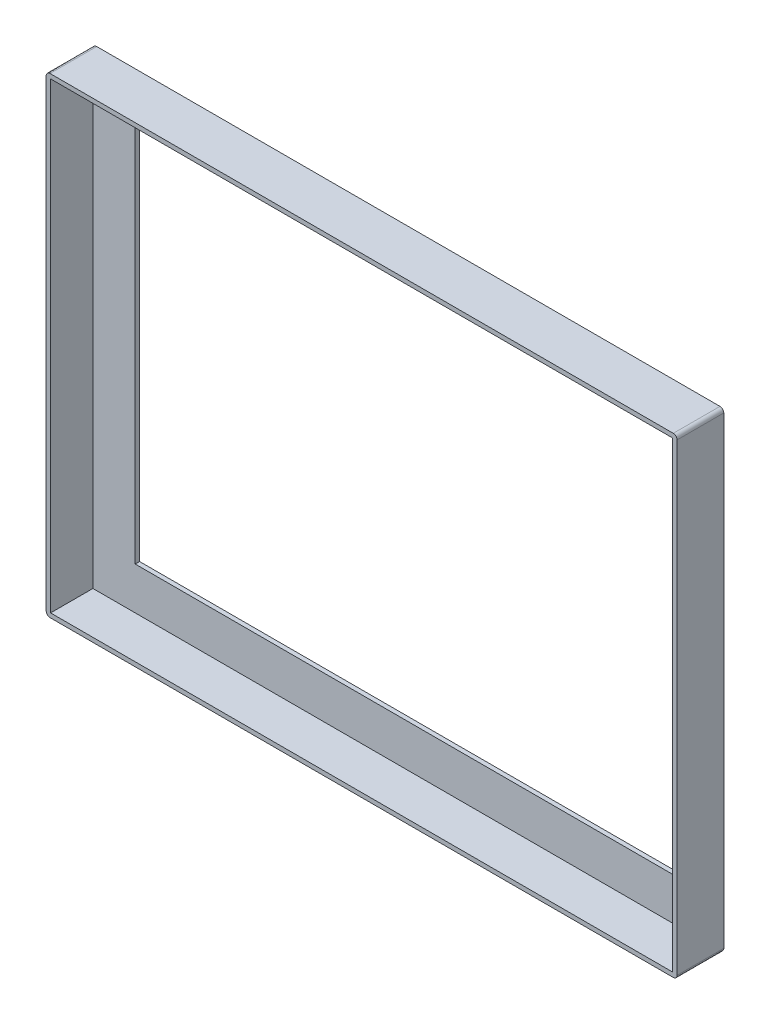
ISO-10303-21;
HEADER;
FILE_DESCRIPTION(('STEP AP214'),'2;1');
FILE_NAME('part.step','',(''),(''),'','','');
FILE_SCHEMA(('AUTOMOTIVE_DESIGN { 1 0 10303 214 1 1 1 1 }'));
ENDSEC;
DATA;
#1=APPLICATION_CONTEXT('core data for automotive mechanical design processes');
#2=APPLICATION_PROTOCOL_DEFINITION('international standard','automotive_design',2000,#1);
#3=PRODUCT_CONTEXT('',#1,'mechanical');
#4=PRODUCT('Part','Part','',(#3));
#5=PRODUCT_RELATED_PRODUCT_CATEGORY('part','',(#4));
#6=PRODUCT_DEFINITION_FORMATION('','',#4);
#7=PRODUCT_DEFINITION_CONTEXT('part definition',#1,'design');
#8=PRODUCT_DEFINITION('design','',#6,#7);
#9=PRODUCT_DEFINITION_SHAPE('','',#8);
#10=(LENGTH_UNIT() NAMED_UNIT(*) SI_UNIT(.MILLI.,.METRE.));
#11=(NAMED_UNIT(*) PLANE_ANGLE_UNIT() SI_UNIT($,.RADIAN.));
#12=(NAMED_UNIT(*) SI_UNIT($,.STERADIAN.) SOLID_ANGLE_UNIT());
#13=UNCERTAINTY_MEASURE_WITH_UNIT(LENGTH_MEASURE(1.E-05),#10,'distance_accuracy_value','');
#14=(GEOMETRIC_REPRESENTATION_CONTEXT(3) GLOBAL_UNCERTAINTY_ASSIGNED_CONTEXT((#13)) GLOBAL_UNIT_ASSIGNED_CONTEXT((#10,
#11,#12)) REPRESENTATION_CONTEXT('',''));
#15=CARTESIAN_POINT('',(0.,0.,0.));
#16=DIRECTION('',(0.,0.,1.));
#17=DIRECTION('',(1.,0.,0.));
#18=AXIS2_PLACEMENT_3D('',#15,#16,#17);
#19=CARTESIAN_POINT('',(131.7625,-98.425,19.5072));
#20=DIRECTION('',(-1.,0.,0.));
#21=DIRECTION('',(0.,0.,1.));
#22=AXIS2_PLACEMENT_3D('',#19,#20,#21);
#23=PLANE('',#22);
#24=DIRECTION('',(0.,1.,0.));
#25=VECTOR('',#24,1.);
#26=CARTESIAN_POINT('',(131.7625,-98.425,19.5072));
#27=LINE('',#26,#25);
#28=CARTESIAN_POINT('',(131.7625,-96.8375,19.5072));
#29=VERTEX_POINT('',#28);
#30=CARTESIAN_POINT('',(131.7625,96.8375,19.5072));
#31=VERTEX_POINT('',#30);
#32=EDGE_CURVE('E197',#29,#31,#27,.T.);
#33=ORIENTED_EDGE('',*,*,#32,.F.);
#34=DIRECTION('',(0.,0.,-1.));
#35=VECTOR('',#34,1.);
#36=CARTESIAN_POINT('',(131.7625,-96.8375,19.5072));
#37=LINE('',#36,#35);
#38=CARTESIAN_POINT('',(131.7625,-96.8375,0.));
#39=VERTEX_POINT('',#38);
#40=EDGE_CURVE('E259',#29,#39,#37,.T.);
#41=ORIENTED_EDGE('',*,*,#40,.T.);
#42=DIRECTION('',(0.,1.,0.));
#43=VECTOR('',#42,1.);
#44=CARTESIAN_POINT('',(131.7625,-98.425,0.));
#45=LINE('',#44,#43);
#46=CARTESIAN_POINT('',(131.7625,96.8375,0.));
#47=VERTEX_POINT('',#46);
#48=EDGE_CURVE('E191',#39,#47,#45,.T.);
#49=ORIENTED_EDGE('',*,*,#48,.T.);
#50=DIRECTION('',(0.,0.,-1.));
#51=VECTOR('',#50,1.);
#52=CARTESIAN_POINT('',(131.7625,96.8375,19.5072));
#53=LINE('',#52,#51);
#54=EDGE_CURVE('E234',#47,#31,#53,.F.);
#55=ORIENTED_EDGE('',*,*,#54,.T.);
#56=EDGE_LOOP('',(#33,#41,#49,#55));
#57=FACE_BOUND('',#56,.T.);
#58=ADVANCED_FACE('F15',(#57),#23,.F.);
#59=CARTESIAN_POINT('',(131.7625,98.425,19.5072));
#60=DIRECTION('',(0.,-1.,0.));
#61=DIRECTION('',(0.,0.,-1.));
#62=AXIS2_PLACEMENT_3D('',#59,#60,#61);
#63=PLANE('',#62);
#64=DIRECTION('',(-1.,0.,0.));
#65=VECTOR('',#64,1.);
#66=CARTESIAN_POINT('',(131.7625,98.425,0.));
#67=LINE('',#66,#65);
#68=CARTESIAN_POINT('',(130.175,98.425,0.));
#69=VERTEX_POINT('',#68);
#70=CARTESIAN_POINT('',(-130.175,98.425,0.));
#71=VERTEX_POINT('',#70);
#72=EDGE_CURVE('E212',#69,#71,#67,.T.);
#73=ORIENTED_EDGE('',*,*,#72,.T.);
#74=DIRECTION('',(0.,0.,-1.));
#75=VECTOR('',#74,1.);
#76=CARTESIAN_POINT('',(-130.175,98.425,19.5072));
#77=LINE('',#76,#75);
#78=CARTESIAN_POINT('',(-130.175,98.425,19.5072));
#79=VERTEX_POINT('',#78);
#80=EDGE_CURVE('E255',#71,#79,#77,.F.);
#81=ORIENTED_EDGE('',*,*,#80,.T.);
#82=DIRECTION('',(-1.,0.,0.));
#83=VECTOR('',#82,1.);
#84=CARTESIAN_POINT('',(131.7625,98.425,19.5072));
#85=LINE('',#84,#83);
#86=CARTESIAN_POINT('',(130.175,98.425,19.5072));
#87=VERTEX_POINT('',#86);
#88=EDGE_CURVE('E193',#87,#79,#85,.T.);
#89=ORIENTED_EDGE('',*,*,#88,.F.);
#90=DIRECTION('',(0.,0.,-1.));
#91=VECTOR('',#90,1.);
#92=CARTESIAN_POINT('',(130.175,98.425,19.5072));
#93=LINE('',#92,#91);
#94=EDGE_CURVE('E227',#87,#69,#93,.T.);
#95=ORIENTED_EDGE('',*,*,#94,.T.);
#96=EDGE_LOOP('',(#73,#81,#89,#95));
#97=FACE_BOUND('',#96,.T.);
#98=ADVANCED_FACE('F280',(#97),#63,.F.);
#99=CARTESIAN_POINT('',(-131.7625,98.425,19.5072));
#100=DIRECTION('',(1.,0.,0.));
#101=DIRECTION('',(0.,0.,-1.));
#102=AXIS2_PLACEMENT_3D('',#99,#100,#101);
#103=PLANE('',#102);
#104=DIRECTION('',(0.,-1.,0.));
#105=VECTOR('',#104,1.);
#106=CARTESIAN_POINT('',(-131.7625,98.425,19.5072));
#107=LINE('',#106,#105);
#108=CARTESIAN_POINT('',(-131.7625,96.8375,19.5072));
#109=VERTEX_POINT('',#108);
#110=CARTESIAN_POINT('',(-131.7625,-96.8375,19.5072));
#111=VERTEX_POINT('',#110);
#112=EDGE_CURVE('E196',#109,#111,#107,.T.);
#113=ORIENTED_EDGE('',*,*,#112,.F.);
#114=DIRECTION('',(0.,0.,-1.));
#115=VECTOR('',#114,1.);
#116=CARTESIAN_POINT('',(-131.7625,96.8375,19.5072));
#117=LINE('',#116,#115);
#118=CARTESIAN_POINT('',(-131.7625,96.8375,0.));
#119=VERTEX_POINT('',#118);
#120=EDGE_CURVE('E250',#109,#119,#117,.T.);
#121=ORIENTED_EDGE('',*,*,#120,.T.);
#122=DIRECTION('',(0.,-1.,0.));
#123=VECTOR('',#122,1.);
#124=CARTESIAN_POINT('',(-131.7625,98.425,0.));
#125=LINE('',#124,#123);
#126=CARTESIAN_POINT('',(-131.7625,-96.8375,0.));
#127=VERTEX_POINT('',#126);
#128=EDGE_CURVE('E216',#119,#127,#125,.T.);
#129=ORIENTED_EDGE('',*,*,#128,.T.);
#130=DIRECTION('',(0.,0.,-1.));
#131=VECTOR('',#130,1.);
#132=CARTESIAN_POINT('',(-131.7625,-96.8375,19.5072));
#133=LINE('',#132,#131);
#134=EDGE_CURVE('E245',#127,#111,#133,.F.);
#135=ORIENTED_EDGE('',*,*,#134,.T.);
#136=EDGE_LOOP('',(#113,#121,#129,#135));
#137=FACE_BOUND('',#136,.T.);
#138=ADVANCED_FACE('F287',(#137),#103,.F.);
#139=CARTESIAN_POINT('',(-129.9337,96.5962,19.5072));
#140=DIRECTION('',(1.,0.,0.));
#141=DIRECTION('',(0.,1.,0.));
#142=AXIS2_PLACEMENT_3D('',#139,#140,#141);
#143=PLANE('',#142);
#144=DIRECTION('',(0.,-1.,0.));
#145=VECTOR('',#144,1.);
#146=CARTESIAN_POINT('',(-129.9337,96.5962,1.8288));
#147=LINE('',#146,#145);
#148=CARTESIAN_POINT('',(-129.9337,96.5962,1.8288));
#149=VERTEX_POINT('',#148);
#150=CARTESIAN_POINT('',(-129.9337,-96.5962,1.8288));
#151=VERTEX_POINT('',#150);
#152=EDGE_CURVE('E151',#149,#151,#147,.T.);
#153=ORIENTED_EDGE('',*,*,#152,.F.);
#154=DIRECTION('',(0.,0.,-1.));
#155=VECTOR('',#154,1.);
#156=CARTESIAN_POINT('',(-129.9337,96.5962,19.5072));
#157=LINE('',#156,#155);
#158=CARTESIAN_POINT('',(-129.9337,96.5962,19.5072));
#159=VERTEX_POINT('',#158);
#160=EDGE_CURVE('E224',#159,#149,#157,.T.);
#161=ORIENTED_EDGE('',*,*,#160,.F.);
#162=DIRECTION('',(0.,-1.,0.));
#163=VECTOR('',#162,1.);
#164=CARTESIAN_POINT('',(-129.9337,96.5962,19.5072));
#165=LINE('',#164,#163);
#166=CARTESIAN_POINT('',(-129.9337,-96.5962,19.5072));
#167=VERTEX_POINT('',#166);
#168=EDGE_CURVE('E209',#159,#167,#165,.T.);
#169=ORIENTED_EDGE('',*,*,#168,.T.);
#170=DIRECTION('',(0.,0.,-1.));
#171=VECTOR('',#170,1.);
#172=CARTESIAN_POINT('',(-129.9337,-96.5962,19.5072));
#173=LINE('',#172,#171);
#174=EDGE_CURVE('E139',#167,#151,#173,.T.);
#175=ORIENTED_EDGE('',*,*,#174,.T.);
#176=EDGE_LOOP('',(#153,#161,#169,#175));
#177=FACE_BOUND('',#176,.T.);
#178=ADVANCED_FACE('F466',(#177),#143,.T.);
#179=CARTESIAN_POINT('',(129.9337,96.5962,19.5072));
#180=DIRECTION('',(0.,-1.,0.));
#181=DIRECTION('',(1.,0.,0.));
#182=AXIS2_PLACEMENT_3D('',#179,#180,#181);
#183=PLANE('',#182);
#184=DIRECTION('',(-1.,0.,0.));
#185=VECTOR('',#184,1.);
#186=CARTESIAN_POINT('',(129.9337,96.5962,1.8288));
#187=LINE('',#186,#185);
#188=CARTESIAN_POINT('',(129.9337,96.5962,1.8288));
#189=VERTEX_POINT('',#188);
#190=EDGE_CURVE('E147',#189,#149,#187,.T.);
#191=ORIENTED_EDGE('',*,*,#190,.F.);
#192=DIRECTION('',(0.,0.,-1.));
#193=VECTOR('',#192,1.);
#194=CARTESIAN_POINT('',(129.9337,96.5962,19.5072));
#195=LINE('',#194,#193);
#196=CARTESIAN_POINT('',(129.9337,96.5962,19.5072));
#197=VERTEX_POINT('',#196);
#198=EDGE_CURVE('E138',#197,#189,#195,.T.);
#199=ORIENTED_EDGE('',*,*,#198,.F.);
#200=DIRECTION('',(-1.,0.,0.));
#201=VECTOR('',#200,1.);
#202=CARTESIAN_POINT('',(129.9337,96.5962,19.5072));
#203=LINE('',#202,#201);
#204=EDGE_CURVE('E201',#197,#159,#203,.T.);
#205=ORIENTED_EDGE('',*,*,#204,.T.);
#206=ORIENTED_EDGE('',*,*,#160,.T.);
#207=EDGE_LOOP('',(#191,#199,#205,#206));
#208=FACE_BOUND('',#207,.T.);
#209=ADVANCED_FACE('F456',(#208),#183,.T.);
#210=CARTESIAN_POINT('',(129.9337,-96.5962,19.5072));
#211=DIRECTION('',(-1.,0.,0.));
#212=DIRECTION('',(0.,0.,1.));
#213=AXIS2_PLACEMENT_3D('',#210,#211,#212);
#214=PLANE('',#213);
#215=DIRECTION('',(0.,1.,0.));
#216=VECTOR('',#215,1.);
#217=CARTESIAN_POINT('',(129.9337,-96.5962,1.8288));
#218=LINE('',#217,#216);
#219=CARTESIAN_POINT('',(129.9337,-96.5962,1.8288));
#220=VERTEX_POINT('',#219);
#221=EDGE_CURVE('E143',#220,#189,#218,.T.);
#222=ORIENTED_EDGE('',*,*,#221,.F.);
#223=DIRECTION('',(0.,0.,-1.));
#224=VECTOR('',#223,1.);
#225=CARTESIAN_POINT('',(129.9337,-96.5962,19.5072));
#226=LINE('',#225,#224);
#227=CARTESIAN_POINT('',(129.9337,-96.5962,19.5072));
#228=VERTEX_POINT('',#227);
#229=EDGE_CURVE('E127',#228,#220,#226,.T.);
#230=ORIENTED_EDGE('',*,*,#229,.F.);
#231=DIRECTION('',(0.,1.,0.));
#232=VECTOR('',#231,1.);
#233=CARTESIAN_POINT('',(129.9337,-96.5962,19.5072));
#234=LINE('',#233,#232);
#235=EDGE_CURVE('E206',#228,#197,#234,.T.);
#236=ORIENTED_EDGE('',*,*,#235,.T.);
#237=ORIENTED_EDGE('',*,*,#198,.T.);
#238=EDGE_LOOP('',(#222,#230,#236,#237));
#239=FACE_BOUND('',#238,.T.);
#240=ADVANCED_FACE('F144',(#239),#214,.T.);
#241=CARTESIAN_POINT('',(-129.9337,-96.5962,19.5072));
#242=DIRECTION('',(0.,1.,0.));
#243=DIRECTION('',(-1.,0.,0.));
#244=AXIS2_PLACEMENT_3D('',#241,#242,#243);
#245=PLANE('',#244);
#246=DIRECTION('',(1.,0.,0.));
#247=VECTOR('',#246,1.);
#248=CARTESIAN_POINT('',(-129.9337,-96.5962,1.8288));
#249=LINE('',#248,#247);
#250=EDGE_CURVE('E131',#151,#220,#249,.T.);
#251=ORIENTED_EDGE('',*,*,#250,.F.);
#252=ORIENTED_EDGE('',*,*,#174,.F.);
#253=DIRECTION('',(1.,0.,0.));
#254=VECTOR('',#253,1.);
#255=CARTESIAN_POINT('',(-129.9337,-96.5962,19.5072));
#256=LINE('',#255,#254);
#257=EDGE_CURVE('E134',#167,#228,#256,.T.);
#258=ORIENTED_EDGE('',*,*,#257,.T.);
#259=ORIENTED_EDGE('',*,*,#229,.T.);
#260=EDGE_LOOP('',(#251,#252,#258,#259));
#261=FACE_BOUND('',#260,.T.);
#262=ADVANCED_FACE('F129',(#261),#245,.T.);
#263=CARTESIAN_POINT('',(-131.7625,-98.425,19.5072));
#264=DIRECTION('',(0.,1.,0.));
#265=DIRECTION('',(0.,0.,1.));
#266=AXIS2_PLACEMENT_3D('',#263,#264,#265);
#267=PLANE('',#266);
#268=DIRECTION('',(1.,0.,0.));
#269=VECTOR('',#268,1.);
#270=CARTESIAN_POINT('',(-131.7625,-98.425,0.));
#271=LINE('',#270,#269);
#272=CARTESIAN_POINT('',(-130.175,-98.425,0.));
#273=VERTEX_POINT('',#272);
#274=CARTESIAN_POINT('',(130.175,-98.425,0.));
#275=VERTEX_POINT('',#274);
#276=EDGE_CURVE('E203',#273,#275,#271,.T.);
#277=ORIENTED_EDGE('',*,*,#276,.T.);
#278=DIRECTION('',(0.,0.,-1.));
#279=VECTOR('',#278,1.);
#280=CARTESIAN_POINT('',(130.175,-98.425,19.5072));
#281=LINE('',#280,#279);
#282=CARTESIAN_POINT('',(130.175,-98.425,19.5072));
#283=VERTEX_POINT('',#282);
#284=EDGE_CURVE('E23',#275,#283,#281,.F.);
#285=ORIENTED_EDGE('',*,*,#284,.T.);
#286=DIRECTION('',(1.,0.,0.));
#287=VECTOR('',#286,1.);
#288=CARTESIAN_POINT('',(-131.7625,-98.425,19.5072));
#289=LINE('',#288,#287);
#290=CARTESIAN_POINT('',(-130.175,-98.425,19.5072));
#291=VERTEX_POINT('',#290);
#292=EDGE_CURVE('E199',#291,#283,#289,.T.);
#293=ORIENTED_EDGE('',*,*,#292,.F.);
#294=DIRECTION('',(0.,0.,-1.));
#295=VECTOR('',#294,1.);
#296=CARTESIAN_POINT('',(-130.175,-98.425,19.5072));
#297=LINE('',#296,#295);
#298=EDGE_CURVE('E239',#291,#273,#297,.T.);
#299=ORIENTED_EDGE('',*,*,#298,.T.);
#300=EDGE_LOOP('',(#277,#285,#293,#299));
#301=FACE_BOUND('',#300,.T.);
#302=ADVANCED_FACE('F294',(#301),#267,.F.);
#303=CARTESIAN_POINT('',(0.,0.,19.5072));
#304=DIRECTION('',(0.,0.,1.));
#305=DIRECTION('',(1.,0.,0.));
#306=AXIS2_PLACEMENT_3D('',#303,#304,#305);
#307=PLANE('',#306);
#308=ORIENTED_EDGE('',*,*,#168,.F.);
#309=ORIENTED_EDGE('',*,*,#204,.F.);
#310=ORIENTED_EDGE('',*,*,#235,.F.);
#311=ORIENTED_EDGE('',*,*,#257,.F.);
#312=EDGE_LOOP('',(#308,#309,#310,#311));
#313=FACE_BOUND('',#312,.T.);
#314=ORIENTED_EDGE('',*,*,#292,.T.);
#315=CARTESIAN_POINT('',(130.175,-96.8375,19.5072));
#316=DIRECTION('',(0.,0.,1.));
#317=DIRECTION('',(1.,0.,0.));
#318=AXIS2_PLACEMENT_3D('',#315,#316,#317);
#319=CIRCLE('',#318,1.5875);
#320=EDGE_CURVE('E9',#283,#29,#319,.T.);
#321=ORIENTED_EDGE('',*,*,#320,.T.);
#322=ORIENTED_EDGE('',*,*,#32,.T.);
#323=CARTESIAN_POINT('',(130.175,96.8375,19.5072));
#324=DIRECTION('',(0.,0.,1.));
#325=DIRECTION('',(1.,0.,0.));
#326=AXIS2_PLACEMENT_3D('',#323,#324,#325);
#327=CIRCLE('',#326,1.5875);
#328=EDGE_CURVE('E237',#31,#87,#327,.T.);
#329=ORIENTED_EDGE('',*,*,#328,.T.);
#330=ORIENTED_EDGE('',*,*,#88,.T.);
#331=CARTESIAN_POINT('',(-130.175,96.8375,19.5072));
#332=DIRECTION('',(0.,0.,1.));
#333=DIRECTION('',(1.,0.,0.));
#334=AXIS2_PLACEMENT_3D('',#331,#332,#333);
#335=CIRCLE('',#334,1.5875);
#336=EDGE_CURVE('E257',#79,#109,#335,.T.);
#337=ORIENTED_EDGE('',*,*,#336,.T.);
#338=ORIENTED_EDGE('',*,*,#112,.T.);
#339=CARTESIAN_POINT('',(-130.175,-96.8375,19.5072));
#340=DIRECTION('',(0.,0.,1.));
#341=DIRECTION('',(1.,0.,0.));
#342=AXIS2_PLACEMENT_3D('',#339,#340,#341);
#343=CIRCLE('',#342,1.5875);
#344=EDGE_CURVE('E248',#111,#291,#343,.T.);
#345=ORIENTED_EDGE('',*,*,#344,.T.);
#346=EDGE_LOOP('',(#314,#321,#322,#329,#330,#337,#338,#345));
#347=FACE_BOUND('',#346,.T.);
#348=ADVANCED_FACE('F277',(#313,#347),#307,.T.);
#349=CARTESIAN_POINT('',(0.,0.,0.));
#350=DIRECTION('',(0.,0.,1.));
#351=DIRECTION('',(1.,0.,0.));
#352=AXIS2_PLACEMENT_3D('',#349,#350,#351);
#353=PLANE('',#352);
#354=ORIENTED_EDGE('',*,*,#48,.F.);
#355=CARTESIAN_POINT('',(130.175,-96.8375,0.));
#356=DIRECTION('',(0.,0.,1.));
#357=DIRECTION('',(1.,0.,0.));
#358=AXIS2_PLACEMENT_3D('',#355,#356,#357);
#359=CIRCLE('',#358,1.5875);
#360=EDGE_CURVE('E37',#39,#275,#359,.F.);
#361=ORIENTED_EDGE('',*,*,#360,.T.);
#362=ORIENTED_EDGE('',*,*,#276,.F.);
#363=CARTESIAN_POINT('',(-130.175,-96.8375,0.));
#364=DIRECTION('',(0.,0.,1.));
#365=DIRECTION('',(1.,0.,0.));
#366=AXIS2_PLACEMENT_3D('',#363,#364,#365);
#367=CIRCLE('',#366,1.5875);
#368=EDGE_CURVE('E242',#273,#127,#367,.F.);
#369=ORIENTED_EDGE('',*,*,#368,.T.);
#370=ORIENTED_EDGE('',*,*,#128,.F.);
#371=CARTESIAN_POINT('',(-130.175,96.8375,0.));
#372=DIRECTION('',(0.,0.,1.));
#373=DIRECTION('',(1.,0.,0.));
#374=AXIS2_PLACEMENT_3D('',#371,#372,#373);
#375=CIRCLE('',#374,1.5875);
#376=EDGE_CURVE('E253',#119,#71,#375,.F.);
#377=ORIENTED_EDGE('',*,*,#376,.T.);
#378=ORIENTED_EDGE('',*,*,#72,.F.);
#379=CARTESIAN_POINT('',(130.175,96.8375,0.));
#380=DIRECTION('',(0.,0.,1.));
#381=DIRECTION('',(1.,0.,0.));
#382=AXIS2_PLACEMENT_3D('',#379,#380,#381);
#383=CIRCLE('',#382,1.5875);
#384=EDGE_CURVE('E231',#69,#47,#383,.F.);
#385=ORIENTED_EDGE('',*,*,#384,.T.);
#386=EDGE_LOOP('',(#354,#361,#362,#369,#370,#377,#378,#385));
#387=FACE_BOUND('',#386,.T.);
#388=DIRECTION('',(0.,1.,0.));
#389=VECTOR('',#388,1.);
#390=CARTESIAN_POINT('',(112.2553,-78.9178,0.));
#391=LINE('',#390,#389);
#392=CARTESIAN_POINT('',(112.2553,-78.9178,0.));
#393=VERTEX_POINT('',#392);
#394=CARTESIAN_POINT('',(112.2553,78.9178,0.));
#395=VERTEX_POINT('',#394);
#396=EDGE_CURVE('E152',#393,#395,#391,.T.);
#397=ORIENTED_EDGE('',*,*,#396,.T.);
#398=DIRECTION('',(-1.,0.,0.));
#399=VECTOR('',#398,1.);
#400=CARTESIAN_POINT('',(112.2553,78.9178,0.));
#401=LINE('',#400,#399);
#402=CARTESIAN_POINT('',(-112.2553,78.9178,0.));
#403=VERTEX_POINT('',#402);
#404=EDGE_CURVE('E156',#395,#403,#401,.T.);
#405=ORIENTED_EDGE('',*,*,#404,.T.);
#406=DIRECTION('',(0.,-1.,0.));
#407=VECTOR('',#406,1.);
#408=CARTESIAN_POINT('',(-112.2553,78.9178,0.));
#409=LINE('',#408,#407);
#410=CARTESIAN_POINT('',(-112.2553,-78.9178,0.));
#411=VERTEX_POINT('',#410);
#412=EDGE_CURVE('E178',#403,#411,#409,.T.);
#413=ORIENTED_EDGE('',*,*,#412,.T.);
#414=DIRECTION('',(1.,0.,0.));
#415=VECTOR('',#414,1.);
#416=CARTESIAN_POINT('',(-112.2553,-78.9178,0.));
#417=LINE('',#416,#415);
#418=EDGE_CURVE('E174',#411,#393,#417,.T.);
#419=ORIENTED_EDGE('',*,*,#418,.T.);
#420=EDGE_LOOP('',(#397,#405,#413,#419));
#421=FACE_BOUND('',#420,.T.);
#422=ADVANCED_FACE('F267',(#387,#421),#353,.F.);
#423=CARTESIAN_POINT('',(112.2553,-78.9178,1.8288));
#424=DIRECTION('',(-1.,0.,0.));
#425=DIRECTION('',(0.,0.,1.));
#426=AXIS2_PLACEMENT_3D('',#423,#424,#425);
#427=PLANE('',#426);
#428=ORIENTED_EDGE('',*,*,#396,.F.);
#429=DIRECTION('',(0.,0.,-1.));
#430=VECTOR('',#429,1.);
#431=CARTESIAN_POINT('',(112.2553,-78.9178,1.8288));
#432=LINE('',#431,#430);
#433=CARTESIAN_POINT('',(112.2553,-78.9178,1.8288));
#434=VERTEX_POINT('',#433);
#435=EDGE_CURVE('E189',#434,#393,#432,.T.);
#436=ORIENTED_EDGE('',*,*,#435,.F.);
#437=DIRECTION('',(0.,1.,0.));
#438=VECTOR('',#437,1.);
#439=CARTESIAN_POINT('',(112.2553,-78.9178,1.8288));
#440=LINE('',#439,#438);
#441=CARTESIAN_POINT('',(112.2553,78.9178,1.8288));
#442=VERTEX_POINT('',#441);
#443=EDGE_CURVE('E170',#434,#442,#440,.T.);
#444=ORIENTED_EDGE('',*,*,#443,.T.);
#445=DIRECTION('',(0.,0.,-1.));
#446=VECTOR('',#445,1.);
#447=CARTESIAN_POINT('',(112.2553,78.9178,1.8288));
#448=LINE('',#447,#446);
#449=EDGE_CURVE('E173',#442,#395,#448,.T.);
#450=ORIENTED_EDGE('',*,*,#449,.T.);
#451=EDGE_LOOP('',(#428,#436,#444,#450));
#452=FACE_BOUND('',#451,.T.);
#453=ADVANCED_FACE('F398',(#452),#427,.T.);
#454=CARTESIAN_POINT('',(-112.2553,-78.9178,1.8288));
#455=DIRECTION('',(0.,1.,0.));
#456=DIRECTION('',(0.,0.,1.));
#457=AXIS2_PLACEMENT_3D('',#454,#455,#456);
#458=PLANE('',#457);
#459=ORIENTED_EDGE('',*,*,#418,.F.);
#460=DIRECTION('',(0.,0.,-1.));
#461=VECTOR('',#460,1.);
#462=CARTESIAN_POINT('',(-112.2553,-78.9178,1.8288));
#463=LINE('',#462,#461);
#464=CARTESIAN_POINT('',(-112.2553,-78.9178,1.8288));
#465=VERTEX_POINT('',#464);
#466=EDGE_CURVE('E188',#465,#411,#463,.T.);
#467=ORIENTED_EDGE('',*,*,#466,.F.);
#468=DIRECTION('',(1.,0.,0.));
#469=VECTOR('',#468,1.);
#470=CARTESIAN_POINT('',(-112.2553,-78.9178,1.8288));
#471=LINE('',#470,#469);
#472=EDGE_CURVE('E161',#465,#434,#471,.T.);
#473=ORIENTED_EDGE('',*,*,#472,.T.);
#474=ORIENTED_EDGE('',*,*,#435,.T.);
#475=EDGE_LOOP('',(#459,#467,#473,#474));
#476=FACE_BOUND('',#475,.T.);
#477=ADVANCED_FACE('F387',(#476),#458,.T.);
#478=CARTESIAN_POINT('',(-112.2553,78.9178,1.8288));
#479=DIRECTION('',(1.,0.,0.));
#480=DIRECTION('',(0.,0.,-1.));
#481=AXIS2_PLACEMENT_3D('',#478,#479,#480);
#482=PLANE('',#481);
#483=ORIENTED_EDGE('',*,*,#412,.F.);
#484=DIRECTION('',(0.,0.,-1.));
#485=VECTOR('',#484,1.);
#486=CARTESIAN_POINT('',(-112.2553,78.9178,1.8288));
#487=LINE('',#486,#485);
#488=CARTESIAN_POINT('',(-112.2553,78.9178,1.8288));
#489=VERTEX_POINT('',#488);
#490=EDGE_CURVE('E186',#489,#403,#487,.T.);
#491=ORIENTED_EDGE('',*,*,#490,.F.);
#492=DIRECTION('',(0.,-1.,0.));
#493=VECTOR('',#492,1.);
#494=CARTESIAN_POINT('',(-112.2553,78.9178,1.8288));
#495=LINE('',#494,#493);
#496=EDGE_CURVE('E164',#489,#465,#495,.T.);
#497=ORIENTED_EDGE('',*,*,#496,.T.);
#498=ORIENTED_EDGE('',*,*,#466,.T.);
#499=EDGE_LOOP('',(#483,#491,#497,#498));
#500=FACE_BOUND('',#499,.T.);
#501=ADVANCED_FACE('F376',(#500),#482,.T.);
#502=CARTESIAN_POINT('',(112.2553,78.9178,1.8288));
#503=DIRECTION('',(0.,-1.,0.));
#504=DIRECTION('',(0.,0.,-1.));
#505=AXIS2_PLACEMENT_3D('',#502,#503,#504);
#506=PLANE('',#505);
#507=ORIENTED_EDGE('',*,*,#404,.F.);
#508=ORIENTED_EDGE('',*,*,#449,.F.);
#509=DIRECTION('',(-1.,0.,0.));
#510=VECTOR('',#509,1.);
#511=CARTESIAN_POINT('',(112.2553,78.9178,1.8288));
#512=LINE('',#511,#510);
#513=EDGE_CURVE('E167',#442,#489,#512,.T.);
#514=ORIENTED_EDGE('',*,*,#513,.T.);
#515=ORIENTED_EDGE('',*,*,#490,.T.);
#516=EDGE_LOOP('',(#507,#508,#514,#515));
#517=FACE_BOUND('',#516,.T.);
#518=ADVANCED_FACE('F364',(#517),#506,.T.);
#519=CARTESIAN_POINT('',(0.,0.,1.8288));
#520=DIRECTION('',(0.,0.,1.));
#521=DIRECTION('',(1.,0.,0.));
#522=AXIS2_PLACEMENT_3D('',#519,#520,#521);
#523=PLANE('',#522);
#524=ORIENTED_EDGE('',*,*,#443,.F.);
#525=ORIENTED_EDGE('',*,*,#472,.F.);
#526=ORIENTED_EDGE('',*,*,#496,.F.);
#527=ORIENTED_EDGE('',*,*,#513,.F.);
#528=EDGE_LOOP('',(#524,#525,#526,#527));
#529=FACE_BOUND('',#528,.T.);
#530=ORIENTED_EDGE('',*,*,#250,.T.);
#531=ORIENTED_EDGE('',*,*,#221,.T.);
#532=ORIENTED_EDGE('',*,*,#190,.T.);
#533=ORIENTED_EDGE('',*,*,#152,.T.);
#534=EDGE_LOOP('',(#530,#531,#532,#533));
#535=FACE_BOUND('',#534,.T.);
#536=ADVANCED_FACE('F150',(#529,#535),#523,.T.);
#537=CARTESIAN_POINT('',(130.175,96.8375,19.5072));
#538=DIRECTION('',(0.,0.,-1.));
#539=DIRECTION('',(-1.,0.,0.));
#540=AXIS2_PLACEMENT_3D('',#537,#538,#539);
#541=CYLINDRICAL_SURFACE('',#540,1.5875);
#542=ORIENTED_EDGE('',*,*,#328,.F.);
#543=ORIENTED_EDGE('',*,*,#54,.F.);
#544=ORIENTED_EDGE('',*,*,#384,.F.);
#545=ORIENTED_EDGE('',*,*,#94,.F.);
#546=EDGE_LOOP('',(#542,#543,#544,#545));
#547=FACE_BOUND('',#546,.T.);
#548=ADVANCED_FACE('F274',(#547),#541,.T.);
#549=CARTESIAN_POINT('',(-130.175,-96.8375,19.5072));
#550=DIRECTION('',(0.,0.,-1.));
#551=DIRECTION('',(-1.,0.,0.));
#552=AXIS2_PLACEMENT_3D('',#549,#550,#551);
#553=CYLINDRICAL_SURFACE('',#552,1.5875);
#554=ORIENTED_EDGE('',*,*,#344,.F.);
#555=ORIENTED_EDGE('',*,*,#134,.F.);
#556=ORIENTED_EDGE('',*,*,#368,.F.);
#557=ORIENTED_EDGE('',*,*,#298,.F.);
#558=EDGE_LOOP('',(#554,#555,#556,#557));
#559=FACE_BOUND('',#558,.T.);
#560=ADVANCED_FACE('F293',(#559),#553,.T.);
#561=CARTESIAN_POINT('',(-130.175,96.8375,19.5072));
#562=DIRECTION('',(0.,0.,-1.));
#563=DIRECTION('',(-1.,0.,0.));
#564=AXIS2_PLACEMENT_3D('',#561,#562,#563);
#565=CYLINDRICAL_SURFACE('',#564,1.5875);
#566=ORIENTED_EDGE('',*,*,#336,.F.);
#567=ORIENTED_EDGE('',*,*,#80,.F.);
#568=ORIENTED_EDGE('',*,*,#376,.F.);
#569=ORIENTED_EDGE('',*,*,#120,.F.);
#570=EDGE_LOOP('',(#566,#567,#568,#569));
#571=FACE_BOUND('',#570,.T.);
#572=ADVANCED_FACE('F283',(#571),#565,.T.);
#573=CARTESIAN_POINT('',(130.175,-96.8375,19.5072));
#574=DIRECTION('',(0.,0.,-1.));
#575=DIRECTION('',(-1.,0.,0.));
#576=AXIS2_PLACEMENT_3D('',#573,#574,#575);
#577=CYLINDRICAL_SURFACE('',#576,1.5875);
#578=ORIENTED_EDGE('',*,*,#320,.F.);
#579=ORIENTED_EDGE('',*,*,#284,.F.);
#580=ORIENTED_EDGE('',*,*,#360,.F.);
#581=ORIENTED_EDGE('',*,*,#40,.F.);
#582=EDGE_LOOP('',(#578,#579,#580,#581));
#583=FACE_BOUND('',#582,.T.);
#584=ADVANCED_FACE('F17',(#583),#577,.T.);
#585=CLOSED_SHELL('',(#58,#98,#138,#178,#209,#240,#262,#302,#348,#422,#453,#477,#501,#518,#536,
#548,#560,#572,#584));
#586=MANIFOLD_SOLID_BREP('B1',#585);
#587=ADVANCED_BREP_SHAPE_REPRESENTATION('',(#18,#586),#14);
#588=SHAPE_DEFINITION_REPRESENTATION(#9,#587);
ENDSEC;
END-ISO-10303-21;
